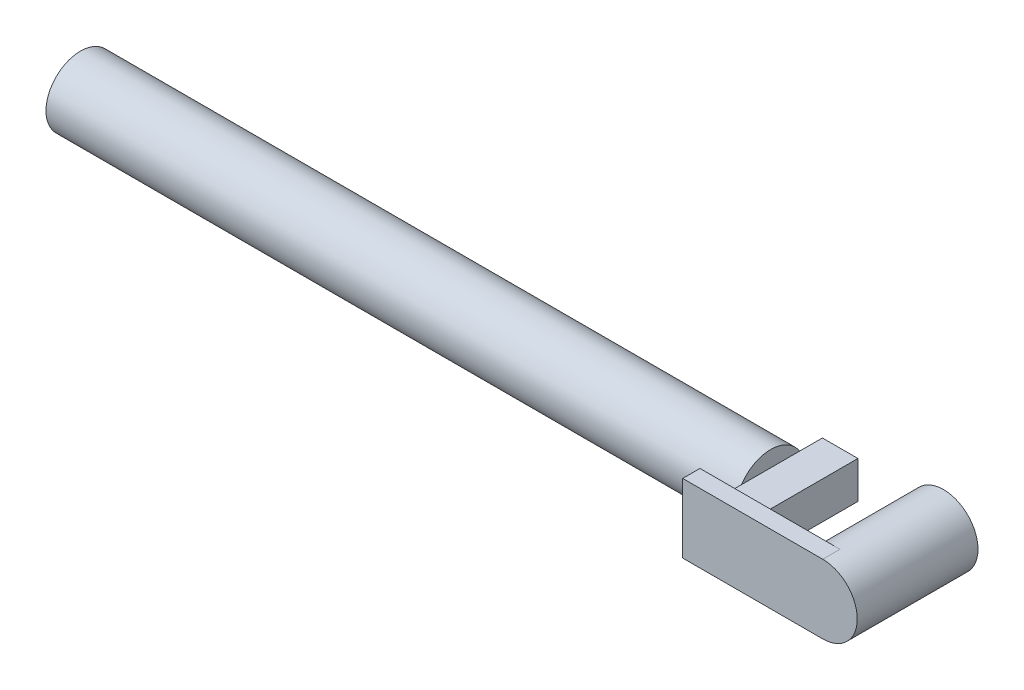
ISO-10303-21;
HEADER;
FILE_DESCRIPTION(('STEP AP214'),'2;1');
FILE_NAME('part.step','',(''),(''),'','','');
FILE_SCHEMA(('AUTOMOTIVE_DESIGN { 1 0 10303 214 1 1 1 1 }'));
ENDSEC;
DATA;
#1=APPLICATION_CONTEXT('core data for automotive mechanical design processes');
#2=APPLICATION_PROTOCOL_DEFINITION('international standard','automotive_design',2000,#1);
#3=PRODUCT_CONTEXT('',#1,'mechanical');
#4=PRODUCT('Part','Part','',(#3));
#5=PRODUCT_RELATED_PRODUCT_CATEGORY('part','',(#4));
#6=PRODUCT_DEFINITION_FORMATION('','',#4);
#7=PRODUCT_DEFINITION_CONTEXT('part definition',#1,'design');
#8=PRODUCT_DEFINITION('design','',#6,#7);
#9=PRODUCT_DEFINITION_SHAPE('','',#8);
#10=(LENGTH_UNIT() NAMED_UNIT(*) SI_UNIT(.MILLI.,.METRE.));
#11=(NAMED_UNIT(*) PLANE_ANGLE_UNIT() SI_UNIT($,.RADIAN.));
#12=(NAMED_UNIT(*) SI_UNIT($,.STERADIAN.) SOLID_ANGLE_UNIT());
#13=UNCERTAINTY_MEASURE_WITH_UNIT(LENGTH_MEASURE(1.E-05),#10,'distance_accuracy_value','');
#14=(GEOMETRIC_REPRESENTATION_CONTEXT(3) GLOBAL_UNCERTAINTY_ASSIGNED_CONTEXT((#13)) GLOBAL_UNIT_ASSIGNED_CONTEXT((#10,
#11,#12)) REPRESENTATION_CONTEXT('',''));
#15=CARTESIAN_POINT('',(0.,0.,0.));
#16=DIRECTION('',(0.,0.,1.));
#17=DIRECTION('',(1.,0.,0.));
#18=AXIS2_PLACEMENT_3D('',#15,#16,#17);
#19=CARTESIAN_POINT('',(-35.0936822372001,-5.39170307818175,-15.));
#20=DIRECTION('',(1.,0.,0.));
#21=DIRECTION('',(0.,0.,-1.));
#22=AXIS2_PLACEMENT_3D('',#19,#20,#21);
#23=PLANE('',#22);
#24=CARTESIAN_POINT('',(-35.0936822372001,0.,0.));
#25=DIRECTION('',(-1.,0.,0.));
#26=DIRECTION('',(0.,0.,1.));
#27=AXIS2_PLACEMENT_3D('',#24,#25,#26);
#28=CIRCLE('',#27,10.);
#29=CARTESIAN_POINT('',(-35.0936822372001,-5.39170307818175,8.42196757989043));
#30=VERTEX_POINT('',#29);
#31=CARTESIAN_POINT('',(-35.0936822372001,5.39170307818175,8.42196757989043));
#32=VERTEX_POINT('',#31);
#33=EDGE_CURVE('E126',#30,#32,#28,.T.);
#34=ORIENTED_EDGE('',*,*,#33,.F.);
#35=DIRECTION('',(0.,0.,1.));
#36=VECTOR('',#35,1.);
#37=CARTESIAN_POINT('',(-35.0936822372001,-5.39170307818175,-15.));
#38=LINE('',#37,#36);
#39=CARTESIAN_POINT('',(-35.0936822372001,-5.39170307818175,15.));
#40=VERTEX_POINT('',#39);
#41=EDGE_CURVE('E114',#30,#40,#38,.T.);
#42=ORIENTED_EDGE('',*,*,#41,.T.);
#43=DIRECTION('',(0.,1.,0.));
#44=VECTOR('',#43,1.);
#45=CARTESIAN_POINT('',(-35.0936822372001,-5.39170307818175,15.));
#46=LINE('',#45,#44);
#47=CARTESIAN_POINT('',(-35.0936822372001,5.39170307818175,15.));
#48=VERTEX_POINT('',#47);
#49=EDGE_CURVE('E144',#40,#48,#46,.T.);
#50=ORIENTED_EDGE('',*,*,#49,.T.);
#51=DIRECTION('',(0.,0.,1.));
#52=VECTOR('',#51,1.);
#53=CARTESIAN_POINT('',(-35.0936822372001,5.39170307818175,-15.));
#54=LINE('',#53,#52);
#55=EDGE_CURVE('E51',#32,#48,#54,.T.);
#56=ORIENTED_EDGE('',*,*,#55,.F.);
#57=EDGE_LOOP('',(#34,#42,#50,#56));
#58=FACE_BOUND('',#57,.T.);
#59=ADVANCED_FACE('F36',(#58),#23,.F.);
#60=CARTESIAN_POINT('',(0.,0.,15.));
#61=DIRECTION('',(0.,0.,1.));
#62=DIRECTION('',(1.,0.,0.));
#63=AXIS2_PLACEMENT_3D('',#60,#61,#62);
#64=PLANE('',#63);
#65=DIRECTION('',(-1.,0.,0.));
#66=VECTOR('',#65,1.);
#67=CARTESIAN_POINT('',(0.,10.,15.));
#68=LINE('',#67,#66);
#69=CARTESIAN_POINT('',(0.,10.,15.));
#70=VERTEX_POINT('',#69);
#71=CARTESIAN_POINT('',(-40.5759579402201,10.,15.));
#72=VERTEX_POINT('',#71);
#73=EDGE_CURVE('E168',#70,#72,#68,.T.);
#74=ORIENTED_EDGE('',*,*,#73,.F.);
#75=CARTESIAN_POINT('',(0.,0.,15.));
#76=DIRECTION('',(0.,0.,1.));
#77=DIRECTION('',(1.,0.,0.));
#78=AXIS2_PLACEMENT_3D('',#75,#76,#77);
#79=CIRCLE('',#78,10.);
#80=CARTESIAN_POINT('',(0.,-10.,15.));
#81=VERTEX_POINT('',#80);
#82=EDGE_CURVE('E11',#70,#81,#79,.T.);
#83=ORIENTED_EDGE('',*,*,#82,.T.);
#84=DIRECTION('',(1.,0.,0.));
#85=VECTOR('',#84,1.);
#86=CARTESIAN_POINT('',(-40.5759579402201,-10.,15.));
#87=LINE('',#86,#85);
#88=CARTESIAN_POINT('',(-40.5759579402201,-10.,15.));
#89=VERTEX_POINT('',#88);
#90=EDGE_CURVE('E173',#89,#81,#87,.T.);
#91=ORIENTED_EDGE('',*,*,#90,.F.);
#92=DIRECTION('',(0.,-1.,0.));
#93=VECTOR('',#92,1.);
#94=CARTESIAN_POINT('',(-40.5759579402201,10.,15.));
#95=LINE('',#94,#93);
#96=EDGE_CURVE('E181',#72,#89,#95,.T.);
#97=ORIENTED_EDGE('',*,*,#96,.F.);
#98=EDGE_LOOP('',(#74,#83,#91,#97));
#99=FACE_BOUND('',#98,.T.);
#100=ORIENTED_EDGE('',*,*,#49,.F.);
#101=DIRECTION('',(-1.,0.,0.));
#102=VECTOR('',#101,1.);
#103=CARTESIAN_POINT('',(-24.7979678165514,-5.39170307818175,15.));
#104=LINE('',#103,#102);
#105=CARTESIAN_POINT('',(-24.7979678165514,-5.39170307818175,15.));
#106=VERTEX_POINT('',#105);
#107=EDGE_CURVE('E120',#106,#40,#104,.T.);
#108=ORIENTED_EDGE('',*,*,#107,.F.);
#109=DIRECTION('',(0.,-1.,0.));
#110=VECTOR('',#109,1.);
#111=CARTESIAN_POINT('',(-24.7979678165514,-5.39170307818175,15.));
#112=LINE('',#111,#110);
#113=CARTESIAN_POINT('',(-24.7979678165514,5.39170307818175,15.));
#114=VERTEX_POINT('',#113);
#115=EDGE_CURVE('E157',#114,#106,#112,.T.);
#116=ORIENTED_EDGE('',*,*,#115,.F.);
#117=DIRECTION('',(1.,0.,0.));
#118=VECTOR('',#117,1.);
#119=CARTESIAN_POINT('',(-24.7979678165514,5.39170307818175,15.));
#120=LINE('',#119,#118);
#121=EDGE_CURVE('E154',#48,#114,#120,.T.);
#122=ORIENTED_EDGE('',*,*,#121,.F.);
#123=EDGE_LOOP('',(#100,#108,#116,#122));
#124=FACE_BOUND('',#123,.T.);
#125=ADVANCED_FACE('F210',(#99,#124),#64,.F.);
#126=CARTESIAN_POINT('',(0.,0.,15.));
#127=DIRECTION('',(0.,0.,-1.));
#128=DIRECTION('',(-1.,0.,0.));
#129=AXIS2_PLACEMENT_3D('',#126,#127,#128);
#130=CYLINDRICAL_SURFACE('',#129,10.);
#131=ORIENTED_EDGE('',*,*,#82,.F.);
#132=DIRECTION('',(0.,0.,-1.));
#133=VECTOR('',#132,1.);
#134=CARTESIAN_POINT('',(0.,10.,20.));
#135=LINE('',#134,#133);
#136=CARTESIAN_POINT('',(0.,10.,20.));
#137=VERTEX_POINT('',#136);
#138=EDGE_CURVE('E193',#137,#70,#135,.T.);
#139=ORIENTED_EDGE('',*,*,#138,.F.);
#140=CARTESIAN_POINT('',(0.,0.,20.));
#141=DIRECTION('',(0.,0.,1.));
#142=DIRECTION('',(1.,0.,0.));
#143=AXIS2_PLACEMENT_3D('',#140,#141,#142);
#144=CIRCLE('',#143,10.);
#145=CARTESIAN_POINT('',(0.,-10.,20.));
#146=VERTEX_POINT('',#145);
#147=EDGE_CURVE('E169',#146,#137,#144,.T.);
#148=ORIENTED_EDGE('',*,*,#147,.F.);
#149=DIRECTION('',(0.,0.,-1.));
#150=VECTOR('',#149,1.);
#151=CARTESIAN_POINT('',(0.,-10.,20.));
#152=LINE('',#151,#150);
#153=EDGE_CURVE('E179',#146,#81,#152,.T.);
#154=ORIENTED_EDGE('',*,*,#153,.T.);
#155=EDGE_LOOP('',(#131,#139,#148,#154));
#156=FACE_BOUND('',#155,.T.);
#157=CARTESIAN_POINT('',(0.,0.,-15.));
#158=DIRECTION('',(0.,0.,1.));
#159=DIRECTION('',(1.,0.,0.));
#160=AXIS2_PLACEMENT_3D('',#157,#158,#159);
#161=CIRCLE('',#160,10.);
#162=CARTESIAN_POINT('',(10.,0.,-15.));
#163=VERTEX_POINT('',#162);
#164=EDGE_CURVE('E40',#163,#163,#161,.T.);
#165=ORIENTED_EDGE('',*,*,#164,.T.);
#166=EDGE_LOOP('',(#165));
#167=FACE_BOUND('',#166,.T.);
#168=ADVANCED_FACE('F38',(#156,#167),#130,.T.);
#169=CARTESIAN_POINT('',(0.,0.,-15.));
#170=DIRECTION('',(0.,0.,1.));
#171=DIRECTION('',(1.,0.,0.));
#172=AXIS2_PLACEMENT_3D('',#169,#170,#171);
#173=PLANE('',#172);
#174=ORIENTED_EDGE('',*,*,#164,.F.);
#175=EDGE_LOOP('',(#174));
#176=FACE_BOUND('',#175,.T.);
#177=ADVANCED_FACE('F201',(#176),#173,.F.);
#178=CARTESIAN_POINT('',(0.,10.,20.));
#179=DIRECTION('',(0.,-1.,0.));
#180=DIRECTION('',(0.,0.,-1.));
#181=AXIS2_PLACEMENT_3D('',#178,#179,#180);
#182=PLANE('',#181);
#183=ORIENTED_EDGE('',*,*,#73,.T.);
#184=DIRECTION('',(0.,0.,-1.));
#185=VECTOR('',#184,1.);
#186=CARTESIAN_POINT('',(-40.5759579402201,10.,20.));
#187=LINE('',#186,#185);
#188=CARTESIAN_POINT('',(-40.5759579402201,10.,20.));
#189=VERTEX_POINT('',#188);
#190=EDGE_CURVE('E190',#189,#72,#187,.T.);
#191=ORIENTED_EDGE('',*,*,#190,.F.);
#192=DIRECTION('',(-1.,0.,0.));
#193=VECTOR('',#192,1.);
#194=CARTESIAN_POINT('',(0.,10.,20.));
#195=LINE('',#194,#193);
#196=EDGE_CURVE('E172',#137,#189,#195,.T.);
#197=ORIENTED_EDGE('',*,*,#196,.F.);
#198=ORIENTED_EDGE('',*,*,#138,.T.);
#199=EDGE_LOOP('',(#183,#191,#197,#198));
#200=FACE_BOUND('',#199,.T.);
#201=ADVANCED_FACE('F203',(#200),#182,.F.);
#202=CARTESIAN_POINT('',(-40.5759579402201,10.,20.));
#203=DIRECTION('',(1.,0.,0.));
#204=DIRECTION('',(0.,0.,-1.));
#205=AXIS2_PLACEMENT_3D('',#202,#203,#204);
#206=PLANE('',#205);
#207=ORIENTED_EDGE('',*,*,#96,.T.);
#208=DIRECTION('',(0.,0.,-1.));
#209=VECTOR('',#208,1.);
#210=CARTESIAN_POINT('',(-40.5759579402201,-10.,20.));
#211=LINE('',#210,#209);
#212=CARTESIAN_POINT('',(-40.5759579402201,-10.,20.));
#213=VERTEX_POINT('',#212);
#214=EDGE_CURVE('E187',#213,#89,#211,.T.);
#215=ORIENTED_EDGE('',*,*,#214,.F.);
#216=DIRECTION('',(0.,-1.,0.));
#217=VECTOR('',#216,1.);
#218=CARTESIAN_POINT('',(-40.5759579402201,10.,20.));
#219=LINE('',#218,#217);
#220=EDGE_CURVE('E175',#189,#213,#219,.T.);
#221=ORIENTED_EDGE('',*,*,#220,.F.);
#222=ORIENTED_EDGE('',*,*,#190,.T.);
#223=EDGE_LOOP('',(#207,#215,#221,#222));
#224=FACE_BOUND('',#223,.T.);
#225=ADVANCED_FACE('F208',(#224),#206,.F.);
#226=CARTESIAN_POINT('',(-40.5759579402201,-10.,20.));
#227=DIRECTION('',(0.,1.,0.));
#228=DIRECTION('',(0.,0.,1.));
#229=AXIS2_PLACEMENT_3D('',#226,#227,#228);
#230=PLANE('',#229);
#231=ORIENTED_EDGE('',*,*,#90,.T.);
#232=ORIENTED_EDGE('',*,*,#153,.F.);
#233=DIRECTION('',(1.,0.,0.));
#234=VECTOR('',#233,1.);
#235=CARTESIAN_POINT('',(-40.5759579402201,-10.,20.));
#236=LINE('',#235,#234);
#237=EDGE_CURVE('E177',#213,#146,#236,.T.);
#238=ORIENTED_EDGE('',*,*,#237,.F.);
#239=ORIENTED_EDGE('',*,*,#214,.T.);
#240=EDGE_LOOP('',(#231,#232,#238,#239));
#241=FACE_BOUND('',#240,.T.);
#242=ADVANCED_FACE('F231',(#241),#230,.F.);
#243=CARTESIAN_POINT('',(0.,0.,20.));
#244=DIRECTION('',(0.,0.,1.));
#245=DIRECTION('',(1.,0.,0.));
#246=AXIS2_PLACEMENT_3D('',#243,#244,#245);
#247=PLANE('',#246);
#248=ORIENTED_EDGE('',*,*,#147,.T.);
#249=ORIENTED_EDGE('',*,*,#196,.T.);
#250=ORIENTED_EDGE('',*,*,#220,.T.);
#251=ORIENTED_EDGE('',*,*,#237,.T.);
#252=EDGE_LOOP('',(#248,#249,#250,#251));
#253=FACE_BOUND('',#252,.T.);
#254=ADVANCED_FACE('F224',(#253),#247,.T.);
#255=CARTESIAN_POINT('',(-35.0936822372001,5.39170307818175,-8.42196757989043));
#256=VERTEX_POINT('',#255);
#257=CARTESIAN_POINT('',(-35.0936822372001,-5.39170307818175,-8.42196757989043));
#258=VERTEX_POINT('',#257);
#259=EDGE_CURVE('E59',#256,#258,#28,.T.);
#260=ORIENTED_EDGE('',*,*,#259,.F.);
#261=CARTESIAN_POINT('',(-35.0936822372001,5.39170307818175,-15.));
#262=VERTEX_POINT('',#261);
#263=EDGE_CURVE('E166',#262,#256,#54,.T.);
#264=ORIENTED_EDGE('',*,*,#263,.F.);
#265=DIRECTION('',(0.,1.,0.));
#266=VECTOR('',#265,1.);
#267=CARTESIAN_POINT('',(-35.0936822372001,-5.39170307818175,-15.));
#268=LINE('',#267,#266);
#269=CARTESIAN_POINT('',(-35.0936822372001,-5.39170307818175,-15.));
#270=VERTEX_POINT('',#269);
#271=EDGE_CURVE('E145',#270,#262,#268,.T.);
#272=ORIENTED_EDGE('',*,*,#271,.F.);
#273=EDGE_CURVE('E124',#270,#258,#38,.T.);
#274=ORIENTED_EDGE('',*,*,#273,.T.);
#275=EDGE_LOOP('',(#260,#264,#272,#274));
#276=FACE_BOUND('',#275,.T.);
#277=ADVANCED_FACE('F214',(#276),#23,.F.);
#278=CARTESIAN_POINT('',(-24.7979678165514,5.39170307818175,-15.));
#279=DIRECTION('',(0.,-1.,0.));
#280=DIRECTION('',(0.,0.,-1.));
#281=AXIS2_PLACEMENT_3D('',#278,#279,#280);
#282=PLANE('',#281);
#283=ORIENTED_EDGE('',*,*,#121,.T.);
#284=DIRECTION('',(0.,0.,1.));
#285=VECTOR('',#284,1.);
#286=CARTESIAN_POINT('',(-24.7979678165514,5.39170307818175,-15.));
#287=LINE('',#286,#285);
#288=CARTESIAN_POINT('',(-24.7979678165514,5.39170307818175,-15.));
#289=VERTEX_POINT('',#288);
#290=EDGE_CURVE('E163',#289,#114,#287,.T.);
#291=ORIENTED_EDGE('',*,*,#290,.F.);
#292=DIRECTION('',(1.,0.,0.));
#293=VECTOR('',#292,1.);
#294=CARTESIAN_POINT('',(-24.7979678165514,5.39170307818175,-15.));
#295=LINE('',#294,#293);
#296=EDGE_CURVE('E148',#262,#289,#295,.T.);
#297=ORIENTED_EDGE('',*,*,#296,.F.);
#298=ORIENTED_EDGE('',*,*,#263,.T.);
#299=DIRECTION('',(0.,0.,-1.));
#300=VECTOR('',#299,1.);
#301=CARTESIAN_POINT('',(-35.0936822372001,5.39170307818175,-15.));
#302=LINE('',#301,#300);
#303=EDGE_CURVE('E141',#32,#256,#302,.T.);
#304=ORIENTED_EDGE('',*,*,#303,.F.);
#305=ORIENTED_EDGE('',*,*,#55,.T.);
#306=EDGE_LOOP('',(#283,#291,#297,#298,#304,#305));
#307=FACE_BOUND('',#306,.T.);
#308=ADVANCED_FACE('F223',(#307),#282,.F.);
#309=CARTESIAN_POINT('',(-24.7979678165514,-5.39170307818175,-15.));
#310=DIRECTION('',(-1.,0.,0.));
#311=DIRECTION('',(0.,0.,1.));
#312=AXIS2_PLACEMENT_3D('',#309,#310,#311);
#313=PLANE('',#312);
#314=ORIENTED_EDGE('',*,*,#115,.T.);
#315=DIRECTION('',(0.,0.,1.));
#316=VECTOR('',#315,1.);
#317=CARTESIAN_POINT('',(-24.7979678165514,-5.39170307818175,-15.));
#318=LINE('',#317,#316);
#319=CARTESIAN_POINT('',(-24.7979678165514,-5.39170307818175,-15.));
#320=VERTEX_POINT('',#319);
#321=EDGE_CURVE('E161',#320,#106,#318,.T.);
#322=ORIENTED_EDGE('',*,*,#321,.F.);
#323=DIRECTION('',(0.,-1.,0.));
#324=VECTOR('',#323,1.);
#325=CARTESIAN_POINT('',(-24.7979678165514,-5.39170307818175,-15.));
#326=LINE('',#325,#324);
#327=EDGE_CURVE('E150',#289,#320,#326,.T.);
#328=ORIENTED_EDGE('',*,*,#327,.F.);
#329=ORIENTED_EDGE('',*,*,#290,.T.);
#330=EDGE_LOOP('',(#314,#322,#328,#329));
#331=FACE_BOUND('',#330,.T.);
#332=ADVANCED_FACE('F229',(#331),#313,.F.);
#333=CARTESIAN_POINT('',(-24.7979678165514,-5.39170307818175,-15.));
#334=DIRECTION('',(0.,1.,0.));
#335=DIRECTION('',(0.,0.,1.));
#336=AXIS2_PLACEMENT_3D('',#333,#334,#335);
#337=PLANE('',#336);
#338=ORIENTED_EDGE('',*,*,#107,.T.);
#339=ORIENTED_EDGE('',*,*,#41,.F.);
#340=EDGE_CURVE('E118',#258,#30,#38,.T.);
#341=ORIENTED_EDGE('',*,*,#340,.F.);
#342=ORIENTED_EDGE('',*,*,#273,.F.);
#343=DIRECTION('',(-1.,0.,0.));
#344=VECTOR('',#343,1.);
#345=CARTESIAN_POINT('',(-24.7979678165514,-5.39170307818175,-15.));
#346=LINE('',#345,#344);
#347=EDGE_CURVE('E122',#320,#270,#346,.T.);
#348=ORIENTED_EDGE('',*,*,#347,.F.);
#349=ORIENTED_EDGE('',*,*,#321,.T.);
#350=EDGE_LOOP('',(#338,#339,#341,#342,#348,#349));
#351=FACE_BOUND('',#350,.T.);
#352=ADVANCED_FACE('F115',(#351),#337,.F.);
#353=CARTESIAN_POINT('',(0.,0.,-15.));
#354=DIRECTION('',(0.,0.,1.));
#355=DIRECTION('',(1.,0.,0.));
#356=AXIS2_PLACEMENT_3D('',#353,#354,#355);
#357=PLANE('',#356);
#358=ORIENTED_EDGE('',*,*,#271,.T.);
#359=ORIENTED_EDGE('',*,*,#296,.T.);
#360=ORIENTED_EDGE('',*,*,#327,.T.);
#361=ORIENTED_EDGE('',*,*,#347,.T.);
#362=EDGE_LOOP('',(#358,#359,#360,#361));
#363=FACE_BOUND('',#362,.T.);
#364=ADVANCED_FACE('F260',(#363),#357,.F.);
#365=CARTESIAN_POINT('',(-35.0936822372001,0.,0.));
#366=DIRECTION('',(-1.,0.,0.));
#367=DIRECTION('',(0.,0.,1.));
#368=AXIS2_PLACEMENT_3D('',#365,#366,#367);
#369=PLANE('',#368);
#370=EDGE_CURVE('E133',#32,#256,#28,.T.);
#371=ORIENTED_EDGE('',*,*,#370,.F.);
#372=ORIENTED_EDGE('',*,*,#303,.T.);
#373=EDGE_LOOP('',(#371,#372));
#374=FACE_BOUND('',#373,.T.);
#375=ADVANCED_FACE('F263',(#374),#369,.F.);
#376=EDGE_CURVE('E131',#258,#30,#28,.T.);
#377=ORIENTED_EDGE('',*,*,#376,.F.);
#378=ORIENTED_EDGE('',*,*,#340,.T.);
#379=EDGE_LOOP('',(#377,#378));
#380=FACE_BOUND('',#379,.T.);
#381=ADVANCED_FACE('F136',(#380),#369,.F.);
#382=CARTESIAN_POINT('',(-235.0936822372,0.,0.));
#383=DIRECTION('',(1.,0.,0.));
#384=DIRECTION('',(0.,0.,-1.));
#385=AXIS2_PLACEMENT_3D('',#382,#383,#384);
#386=CYLINDRICAL_SURFACE('',#385,10.);
#387=CARTESIAN_POINT('',(-235.0936822372,0.,0.));
#388=DIRECTION('',(-1.,0.,0.));
#389=DIRECTION('',(0.,0.,1.));
#390=AXIS2_PLACEMENT_3D('',#387,#388,#389);
#391=CIRCLE('',#390,10.);
#392=CARTESIAN_POINT('',(-235.0936822372,0.,10.));
#393=VERTEX_POINT('',#392);
#394=EDGE_CURVE('E140',#393,#393,#391,.T.);
#395=ORIENTED_EDGE('',*,*,#394,.F.);
#396=EDGE_LOOP('',(#395));
#397=FACE_BOUND('',#396,.T.);
#398=ORIENTED_EDGE('',*,*,#370,.T.);
#399=ORIENTED_EDGE('',*,*,#259,.T.);
#400=ORIENTED_EDGE('',*,*,#376,.T.);
#401=ORIENTED_EDGE('',*,*,#33,.T.);
#402=EDGE_LOOP('',(#398,#399,#400,#401));
#403=FACE_BOUND('',#402,.T.);
#404=ADVANCED_FACE('F137',(#397,#403),#386,.T.);
#405=CARTESIAN_POINT('',(-235.0936822372,0.,0.));
#406=DIRECTION('',(-1.,0.,0.));
#407=DIRECTION('',(0.,0.,1.));
#408=AXIS2_PLACEMENT_3D('',#405,#406,#407);
#409=PLANE('',#408);
#410=ORIENTED_EDGE('',*,*,#394,.T.);
#411=EDGE_LOOP('',(#410));
#412=FACE_BOUND('',#411,.T.);
#413=ADVANCED_FACE('F273',(#412),#409,.T.);
#414=CLOSED_SHELL('',(#59,#125,#168,#177,#201,#225,#242,#254,#277,#308,#332,#352,#364,#375,#381,
#404,#413));
#415=MANIFOLD_SOLID_BREP('B2',#414);
#416=ADVANCED_BREP_SHAPE_REPRESENTATION('',(#18,#415),#14);
#417=SHAPE_DEFINITION_REPRESENTATION(#9,#416);
ENDSEC;
END-ISO-10303-21;
